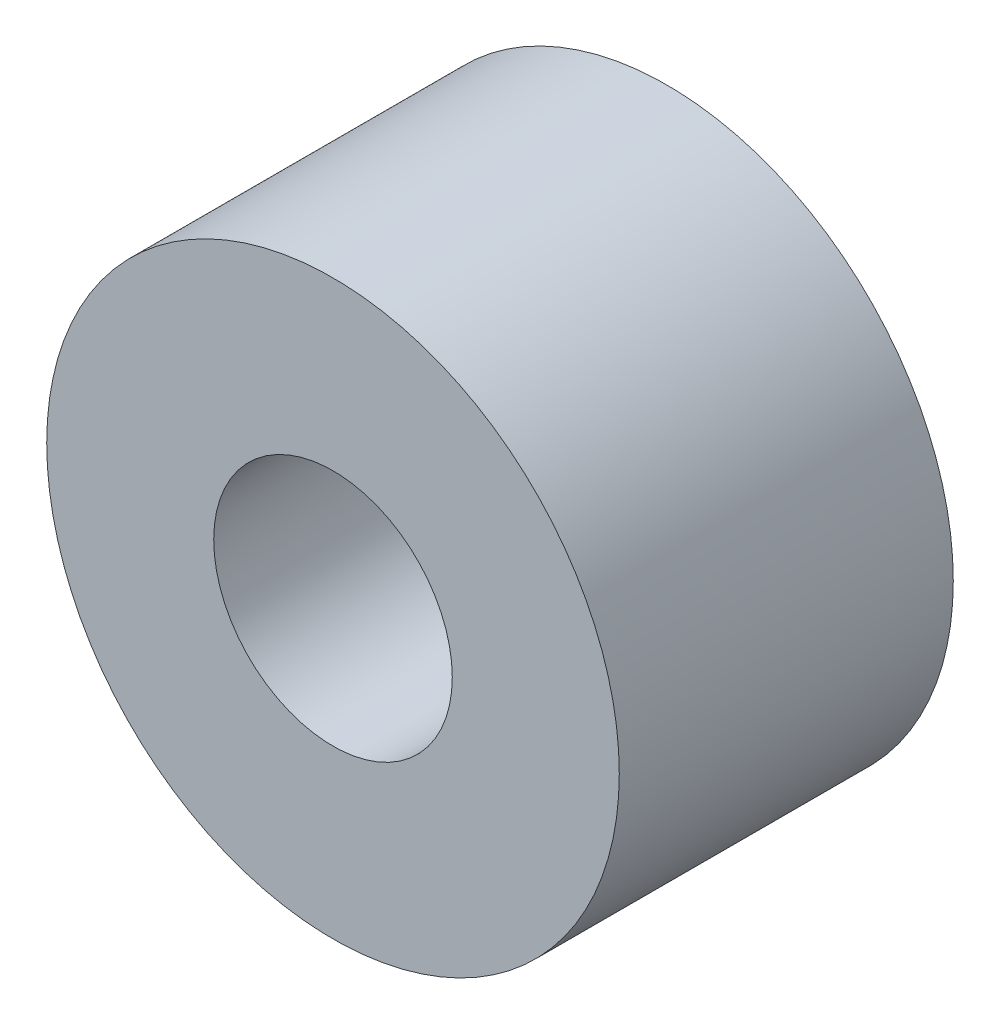
ISO-10303-21;
HEADER;
FILE_DESCRIPTION(('STEP AP214'),'2;1');
FILE_NAME('part.step','',(''),(''),'','','');
FILE_SCHEMA(('AUTOMOTIVE_DESIGN { 1 0 10303 214 1 1 1 1 }'));
ENDSEC;
DATA;
#1=APPLICATION_CONTEXT('core data for automotive mechanical design processes');
#2=APPLICATION_PROTOCOL_DEFINITION('international standard','automotive_design',2000,#1);
#3=PRODUCT_CONTEXT('',#1,'mechanical');
#4=PRODUCT('Part','Part','',(#3));
#5=PRODUCT_RELATED_PRODUCT_CATEGORY('part','',(#4));
#6=PRODUCT_DEFINITION_FORMATION('','',#4);
#7=PRODUCT_DEFINITION_CONTEXT('part definition',#1,'design');
#8=PRODUCT_DEFINITION('design','',#6,#7);
#9=PRODUCT_DEFINITION_SHAPE('','',#8);
#10=(LENGTH_UNIT() NAMED_UNIT(*) SI_UNIT(.MILLI.,.METRE.));
#11=(NAMED_UNIT(*) PLANE_ANGLE_UNIT() SI_UNIT($,.RADIAN.));
#12=(NAMED_UNIT(*) SI_UNIT($,.STERADIAN.) SOLID_ANGLE_UNIT());
#13=UNCERTAINTY_MEASURE_WITH_UNIT(LENGTH_MEASURE(1.E-05),#10,'distance_accuracy_value','');
#14=(GEOMETRIC_REPRESENTATION_CONTEXT(3) GLOBAL_UNCERTAINTY_ASSIGNED_CONTEXT((#13)) GLOBAL_UNIT_ASSIGNED_CONTEXT((#10,
#11,#12)) REPRESENTATION_CONTEXT('',''));
#15=CARTESIAN_POINT('',(0.,0.,0.));
#16=DIRECTION('',(0.,0.,1.));
#17=DIRECTION('',(1.,0.,0.));
#18=AXIS2_PLACEMENT_3D('',#15,#16,#17);
#19=CARTESIAN_POINT('',(0.,0.,7.));
#20=DIRECTION('',(0.,0.,1.));
#21=DIRECTION('',(1.,0.,0.));
#22=AXIS2_PLACEMENT_3D('',#19,#20,#21);
#23=PLANE('',#22);
#24=CARTESIAN_POINT('',(0.,0.,7.));
#25=DIRECTION('',(0.,0.,1.));
#26=DIRECTION('',(1.,0.,0.));
#27=AXIS2_PLACEMENT_3D('',#24,#25,#26);
#28=CIRCLE('',#27,6.);
#29=CARTESIAN_POINT('',(6.,0.,7.));
#30=VERTEX_POINT('',#29);
#31=EDGE_CURVE('E10',#30,#30,#28,.T.);
#32=ORIENTED_EDGE('',*,*,#31,.T.);
#33=EDGE_LOOP('',(#32));
#34=FACE_BOUND('',#33,.T.);
#35=CARTESIAN_POINT('',(0.,0.,7.));
#36=DIRECTION('',(0.,0.,1.));
#37=DIRECTION('',(1.,0.,0.));
#38=AXIS2_PLACEMENT_3D('',#35,#36,#37);
#39=CIRCLE('',#38,2.5);
#40=CARTESIAN_POINT('',(2.5,0.,7.));
#41=VERTEX_POINT('',#40);
#42=EDGE_CURVE('E42',#41,#41,#39,.T.);
#43=ORIENTED_EDGE('',*,*,#42,.F.);
#44=EDGE_LOOP('',(#43));
#45=FACE_BOUND('',#44,.T.);
#46=ADVANCED_FACE('F31',(#34,#45),#23,.T.);
#47=CARTESIAN_POINT('',(0.,0.,0.));
#48=DIRECTION('',(0.,0.,1.));
#49=DIRECTION('',(1.,0.,0.));
#50=AXIS2_PLACEMENT_3D('',#47,#48,#49);
#51=PLANE('',#50);
#52=CARTESIAN_POINT('',(0.,0.,0.));
#53=DIRECTION('',(0.,0.,1.));
#54=DIRECTION('',(1.,0.,0.));
#55=AXIS2_PLACEMENT_3D('',#52,#53,#54);
#56=CIRCLE('',#55,6.);
#57=CARTESIAN_POINT('',(6.,0.,0.));
#58=VERTEX_POINT('',#57);
#59=EDGE_CURVE('E35',#58,#58,#56,.T.);
#60=ORIENTED_EDGE('',*,*,#59,.F.);
#61=EDGE_LOOP('',(#60));
#62=FACE_BOUND('',#61,.T.);
#63=CARTESIAN_POINT('',(0.,0.,0.));
#64=DIRECTION('',(0.,0.,1.));
#65=DIRECTION('',(1.,0.,0.));
#66=AXIS2_PLACEMENT_3D('',#63,#64,#65);
#67=CIRCLE('',#66,2.5);
#68=CARTESIAN_POINT('',(2.5,0.,0.));
#69=VERTEX_POINT('',#68);
#70=EDGE_CURVE('E44',#69,#69,#67,.T.);
#71=ORIENTED_EDGE('',*,*,#70,.T.);
#72=EDGE_LOOP('',(#71));
#73=FACE_BOUND('',#72,.T.);
#74=ADVANCED_FACE('F54',(#62,#73),#51,.F.);
#75=CARTESIAN_POINT('',(0.,0.,7.));
#76=DIRECTION('',(0.,0.,-1.));
#77=DIRECTION('',(-1.,0.,0.));
#78=AXIS2_PLACEMENT_3D('',#75,#76,#77);
#79=CYLINDRICAL_SURFACE('',#78,6.);
#80=ORIENTED_EDGE('',*,*,#31,.F.);
#81=EDGE_LOOP('',(#80));
#82=FACE_BOUND('',#81,.T.);
#83=ORIENTED_EDGE('',*,*,#59,.T.);
#84=EDGE_LOOP('',(#83));
#85=FACE_BOUND('',#84,.T.);
#86=ADVANCED_FACE('F33',(#82,#85),#79,.T.);
#87=CARTESIAN_POINT('',(0.,0.,7.));
#88=DIRECTION('',(0.,0.,-1.));
#89=DIRECTION('',(-1.,0.,0.));
#90=AXIS2_PLACEMENT_3D('',#87,#88,#89);
#91=CYLINDRICAL_SURFACE('',#90,2.5);
#92=ORIENTED_EDGE('',*,*,#42,.T.);
#93=EDGE_LOOP('',(#92));
#94=FACE_BOUND('',#93,.T.);
#95=ORIENTED_EDGE('',*,*,#70,.F.);
#96=EDGE_LOOP('',(#95));
#97=FACE_BOUND('',#96,.T.);
#98=ADVANCED_FACE('F50',(#94,#97),#91,.F.);
#99=CLOSED_SHELL('',(#46,#74,#86,#98));
#100=MANIFOLD_SOLID_BREP('B2',#99);
#101=ADVANCED_BREP_SHAPE_REPRESENTATION('',(#18,#100),#14);
#102=SHAPE_DEFINITION_REPRESENTATION(#9,#101);
ENDSEC;
END-ISO-10303-21;
